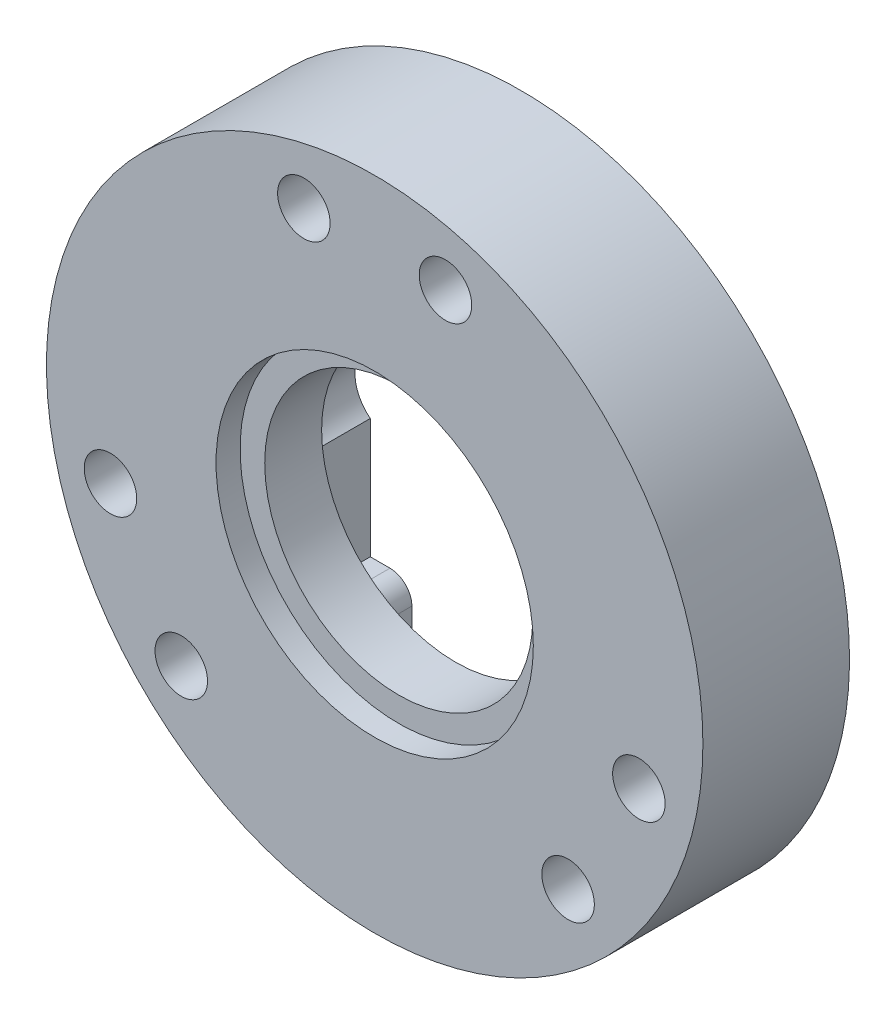
ISO-10303-21;
HEADER;
FILE_DESCRIPTION(('STEP AP214'),'2;1');
FILE_NAME('part.step','',(''),(''),'','','');
FILE_SCHEMA(('AUTOMOTIVE_DESIGN { 1 0 10303 214 1 1 1 1 }'));
ENDSEC;
DATA;
#1=APPLICATION_CONTEXT('core data for automotive mechanical design processes');
#2=APPLICATION_PROTOCOL_DEFINITION('international standard','automotive_design',2000,#1);
#3=PRODUCT_CONTEXT('',#1,'mechanical');
#4=PRODUCT('Part','Part','',(#3));
#5=PRODUCT_RELATED_PRODUCT_CATEGORY('part','',(#4));
#6=PRODUCT_DEFINITION_FORMATION('','',#4);
#7=PRODUCT_DEFINITION_CONTEXT('part definition',#1,'design');
#8=PRODUCT_DEFINITION('design','',#6,#7);
#9=PRODUCT_DEFINITION_SHAPE('','',#8);
#10=(LENGTH_UNIT() NAMED_UNIT(*) SI_UNIT(.MILLI.,.METRE.));
#11=(NAMED_UNIT(*) PLANE_ANGLE_UNIT() SI_UNIT($,.RADIAN.));
#12=(NAMED_UNIT(*) SI_UNIT($,.STERADIAN.) SOLID_ANGLE_UNIT());
#13=UNCERTAINTY_MEASURE_WITH_UNIT(LENGTH_MEASURE(1.E-05),#10,'distance_accuracy_value','');
#14=(GEOMETRIC_REPRESENTATION_CONTEXT(3) GLOBAL_UNCERTAINTY_ASSIGNED_CONTEXT((#13)) GLOBAL_UNIT_ASSIGNED_CONTEXT((#10,
#11,#12)) REPRESENTATION_CONTEXT('',''));
#15=CARTESIAN_POINT('',(0.,0.,0.));
#16=DIRECTION('',(0.,0.,1.));
#17=DIRECTION('',(1.,0.,0.));
#18=AXIS2_PLACEMENT_3D('',#15,#16,#17);
#19=CARTESIAN_POINT('',(0.,0.,5.6));
#20=DIRECTION('',(0.,0.,1.));
#21=DIRECTION('',(1.,0.,0.));
#22=AXIS2_PLACEMENT_3D('',#19,#20,#21);
#23=PLANE('',#22);
#24=CARTESIAN_POINT('',(0.,0.,5.6));
#25=DIRECTION('',(0.,0.,1.));
#26=DIRECTION('',(1.,0.,0.));
#27=AXIS2_PLACEMENT_3D('',#24,#25,#26);
#28=CIRCLE('',#27,6.125);
#29=CARTESIAN_POINT('',(6.125,0.,5.6));
#30=VERTEX_POINT('',#29);
#31=EDGE_CURVE('E337',#30,#30,#28,.T.);
#32=ORIENTED_EDGE('',*,*,#31,.F.);
#33=EDGE_LOOP('',(#32));
#34=FACE_BOUND('',#33,.T.);
#35=CARTESIAN_POINT('',(0.,0.,5.6));
#36=DIRECTION('',(0.,0.,1.));
#37=DIRECTION('',(1.,0.,0.));
#38=AXIS2_PLACEMENT_3D('',#35,#36,#37);
#39=CIRCLE('',#38,7.25);
#40=CARTESIAN_POINT('',(7.25,0.,5.6));
#41=VERTEX_POINT('',#40);
#42=EDGE_CURVE('E220',#41,#41,#39,.F.);
#43=ORIENTED_EDGE('',*,*,#42,.F.);
#44=EDGE_LOOP('',(#43));
#45=FACE_BOUND('',#44,.T.);
#46=ADVANCED_FACE('F35',(#34,#45),#23,.T.);
#47=CARTESIAN_POINT('',(6.90000000000001,-6.9,3.));
#48=DIRECTION('',(1.,0.,0.));
#49=DIRECTION('',(0.,1.,0.));
#50=AXIS2_PLACEMENT_3D('',#47,#48,#49);
#51=PLANE('',#50);
#52=DIRECTION('',(0.,-1.,0.));
#53=VECTOR('',#52,1.);
#54=CARTESIAN_POINT('',(6.90000000000001,-6.9,0.));
#55=LINE('',#54,#53);
#56=CARTESIAN_POINT('',(6.9,6.9,0.));
#57=VERTEX_POINT('',#56);
#58=CARTESIAN_POINT('',(6.9,1.4247806848775,0.));
#59=VERTEX_POINT('',#58);
#60=EDGE_CURVE('E143',#57,#59,#55,.T.);
#61=ORIENTED_EDGE('',*,*,#60,.T.);
#62=DIRECTION('',(0.,0.,1.));
#63=VECTOR('',#62,1.);
#64=CARTESIAN_POINT('',(6.9,1.4247806848775,0.));
#65=LINE('',#64,#63);
#66=CARTESIAN_POINT('',(6.9,1.4247806848775,3.));
#67=VERTEX_POINT('',#66);
#68=EDGE_CURVE('E135',#59,#67,#65,.T.);
#69=ORIENTED_EDGE('',*,*,#68,.T.);
#70=DIRECTION('',(0.,-1.,0.));
#71=VECTOR('',#70,1.);
#72=CARTESIAN_POINT('',(6.90000000000001,-6.9,3.));
#73=LINE('',#72,#71);
#74=CARTESIAN_POINT('',(6.9,6.9,3.));
#75=VERTEX_POINT('',#74);
#76=EDGE_CURVE('E140',#75,#67,#73,.T.);
#77=ORIENTED_EDGE('',*,*,#76,.F.);
#78=DIRECTION('',(0.,0.,-1.));
#79=VECTOR('',#78,1.);
#80=CARTESIAN_POINT('',(6.9,6.9,3.));
#81=LINE('',#80,#79);
#82=EDGE_CURVE('E181',#75,#57,#81,.T.);
#83=ORIENTED_EDGE('',*,*,#82,.T.);
#84=EDGE_LOOP('',(#61,#69,#77,#83));
#85=FACE_BOUND('',#84,.T.);
#86=ADVANCED_FACE('F137',(#85),#51,.F.);
#87=CARTESIAN_POINT('',(-6.9,-6.9,3.));
#88=DIRECTION('',(-1.,0.,0.));
#89=DIRECTION('',(0.,0.,1.));
#90=AXIS2_PLACEMENT_3D('',#87,#88,#89);
#91=PLANE('',#90);
#92=DIRECTION('',(0.,1.,0.));
#93=VECTOR('',#92,1.);
#94=CARTESIAN_POINT('',(-6.9,-6.9,0.));
#95=LINE('',#94,#93);
#96=CARTESIAN_POINT('',(-6.9,-6.9,0.));
#97=VERTEX_POINT('',#96);
#98=CARTESIAN_POINT('',(-6.9,-1.4247806848775,0.));
#99=VERTEX_POINT('',#98);
#100=EDGE_CURVE('E195',#97,#99,#95,.T.);
#101=ORIENTED_EDGE('',*,*,#100,.T.);
#102=DIRECTION('',(0.,0.,1.));
#103=VECTOR('',#102,1.);
#104=CARTESIAN_POINT('',(-6.9,-1.4247806848775,0.));
#105=LINE('',#104,#103);
#106=CARTESIAN_POINT('',(-6.9,-1.4247806848775,3.));
#107=VERTEX_POINT('',#106);
#108=EDGE_CURVE('E330',#99,#107,#105,.T.);
#109=ORIENTED_EDGE('',*,*,#108,.T.);
#110=DIRECTION('',(0.,1.,0.));
#111=VECTOR('',#110,1.);
#112=CARTESIAN_POINT('',(-6.9,-6.9,3.));
#113=LINE('',#112,#111);
#114=CARTESIAN_POINT('',(-6.9,-6.9,3.));
#115=VERTEX_POINT('',#114);
#116=EDGE_CURVE('E177',#115,#107,#113,.T.);
#117=ORIENTED_EDGE('',*,*,#116,.F.);
#118=DIRECTION('',(0.,0.,-1.));
#119=VECTOR('',#118,1.);
#120=CARTESIAN_POINT('',(-6.9,-6.9,3.));
#121=LINE('',#120,#119);
#122=EDGE_CURVE('E203',#115,#97,#121,.T.);
#123=ORIENTED_EDGE('',*,*,#122,.T.);
#124=EDGE_LOOP('',(#101,#109,#117,#123));
#125=FACE_BOUND('',#124,.T.);
#126=ADVANCED_FACE('F277',(#125),#91,.F.);
#127=CARTESIAN_POINT('',(6.90000000000001,-1.42478068487749,3.));
#128=VERTEX_POINT('',#127);
#129=CARTESIAN_POINT('',(6.90000000000001,-6.9,3.));
#130=VERTEX_POINT('',#129);
#131=EDGE_CURVE('E163',#128,#130,#73,.T.);
#132=ORIENTED_EDGE('',*,*,#131,.F.);
#133=DIRECTION('',(0.,0.,1.));
#134=VECTOR('',#133,1.);
#135=CARTESIAN_POINT('',(6.90000000000001,-1.42478068487749,0.));
#136=LINE('',#135,#134);
#137=CARTESIAN_POINT('',(6.90000000000001,-1.42478068487749,0.));
#138=VERTEX_POINT('',#137);
#139=EDGE_CURVE('E147',#128,#138,#136,.F.);
#140=ORIENTED_EDGE('',*,*,#139,.T.);
#141=CARTESIAN_POINT('',(6.90000000000001,-6.9,0.));
#142=VERTEX_POINT('',#141);
#143=EDGE_CURVE('E146',#138,#142,#55,.T.);
#144=ORIENTED_EDGE('',*,*,#143,.T.);
#145=DIRECTION('',(0.,0.,-1.));
#146=VECTOR('',#145,1.);
#147=CARTESIAN_POINT('',(6.90000000000001,-6.9,3.));
#148=LINE('',#147,#146);
#149=EDGE_CURVE('E212',#130,#142,#148,.T.);
#150=ORIENTED_EDGE('',*,*,#149,.F.);
#151=EDGE_LOOP('',(#132,#140,#144,#150));
#152=FACE_BOUND('',#151,.T.);
#153=ADVANCED_FACE('F279',(#152),#51,.F.);
#154=CARTESIAN_POINT('',(6.90000000000001,-6.9,3.));
#155=DIRECTION('',(0.,-1.,0.));
#156=DIRECTION('',(1.,0.,0.));
#157=AXIS2_PLACEMENT_3D('',#154,#155,#156);
#158=PLANE('',#157);
#159=DIRECTION('',(-1.,0.,0.));
#160=VECTOR('',#159,1.);
#161=CARTESIAN_POINT('',(6.90000000000001,-6.9,0.));
#162=LINE('',#161,#160);
#163=CARTESIAN_POINT('',(6.,-6.9,0.));
#164=VERTEX_POINT('',#163);
#165=EDGE_CURVE('E183',#142,#164,#162,.T.);
#166=ORIENTED_EDGE('',*,*,#165,.T.);
#167=DIRECTION('',(0.,0.,-1.));
#168=VECTOR('',#167,1.);
#169=CARTESIAN_POINT('',(6.,-6.9,3.));
#170=LINE('',#169,#168);
#171=CARTESIAN_POINT('',(6.,-6.9,3.));
#172=VERTEX_POINT('',#171);
#173=EDGE_CURVE('E50',#164,#172,#170,.F.);
#174=ORIENTED_EDGE('',*,*,#173,.T.);
#175=DIRECTION('',(-1.,0.,0.));
#176=VECTOR('',#175,1.);
#177=CARTESIAN_POINT('',(6.90000000000001,-6.9,3.));
#178=LINE('',#177,#176);
#179=EDGE_CURVE('E162',#130,#172,#178,.T.);
#180=ORIENTED_EDGE('',*,*,#179,.F.);
#181=ORIENTED_EDGE('',*,*,#149,.T.);
#182=EDGE_LOOP('',(#166,#174,#180,#181));
#183=FACE_BOUND('',#182,.T.);
#184=ADVANCED_FACE('F314',(#183),#158,.F.);
#185=CARTESIAN_POINT('',(5.,-6.9,3.));
#186=DIRECTION('',(1.,0.,0.));
#187=DIRECTION('',(0.,0.,-1.));
#188=AXIS2_PLACEMENT_3D('',#185,#186,#187);
#189=PLANE('',#188);
#190=DIRECTION('',(0.,-1.,0.));
#191=VECTOR('',#190,1.);
#192=CARTESIAN_POINT('',(5.,-6.9,3.));
#193=LINE('',#192,#191);
#194=CARTESIAN_POINT('',(5.,-7.9,3.));
#195=VERTEX_POINT('',#194);
#196=CARTESIAN_POINT('',(5.,-14.1421356237309,3.));
#197=VERTEX_POINT('',#196);
#198=EDGE_CURVE('E165',#195,#197,#193,.T.);
#199=ORIENTED_EDGE('',*,*,#198,.F.);
#200=DIRECTION('',(0.,0.,-1.));
#201=VECTOR('',#200,1.);
#202=CARTESIAN_POINT('',(5.,-7.9,3.));
#203=LINE('',#202,#201);
#204=CARTESIAN_POINT('',(5.,-7.9,0.));
#205=VERTEX_POINT('',#204);
#206=EDGE_CURVE('E232',#195,#205,#203,.T.);
#207=ORIENTED_EDGE('',*,*,#206,.T.);
#208=DIRECTION('',(0.,-1.,0.));
#209=VECTOR('',#208,1.);
#210=CARTESIAN_POINT('',(5.,-6.9,0.));
#211=LINE('',#210,#209);
#212=CARTESIAN_POINT('',(5.,-14.1421356237309,0.));
#213=VERTEX_POINT('',#212);
#214=EDGE_CURVE('E185',#205,#213,#211,.T.);
#215=ORIENTED_EDGE('',*,*,#214,.T.);
#216=DIRECTION('',(0.,0.,-1.));
#217=VECTOR('',#216,1.);
#218=CARTESIAN_POINT('',(5.,-14.1421356237309,3.));
#219=LINE('',#218,#217);
#220=EDGE_CURVE('E209',#197,#213,#219,.T.);
#221=ORIENTED_EDGE('',*,*,#220,.F.);
#222=EDGE_LOOP('',(#199,#207,#215,#221));
#223=FACE_BOUND('',#222,.T.);
#224=ADVANCED_FACE('F263',(#223),#189,.F.);
#225=CARTESIAN_POINT('',(0.,0.,3.));
#226=DIRECTION('',(0.,0.,-1.));
#227=DIRECTION('',(-1.,0.,0.));
#228=AXIS2_PLACEMENT_3D('',#225,#226,#227);
#229=CYLINDRICAL_SURFACE('',#228,15.);
#230=CARTESIAN_POINT('',(0.,0.,0.));
#231=DIRECTION('',(0.,0.,1.));
#232=DIRECTION('',(1.,0.,0.));
#233=AXIS2_PLACEMENT_3D('',#230,#231,#232);
#234=CIRCLE('',#233,15.);
#235=CARTESIAN_POINT('',(-5.00000000000001,-14.1421356237309,0.));
#236=VERTEX_POINT('',#235);
#237=EDGE_CURVE('E187',#213,#236,#234,.T.);
#238=ORIENTED_EDGE('',*,*,#237,.T.);
#239=DIRECTION('',(0.,0.,-1.));
#240=VECTOR('',#239,1.);
#241=CARTESIAN_POINT('',(-5.00000000000001,-14.1421356237309,3.));
#242=LINE('',#241,#240);
#243=CARTESIAN_POINT('',(-5.00000000000001,-14.1421356237309,3.));
#244=VERTEX_POINT('',#243);
#245=EDGE_CURVE('E206',#244,#236,#242,.T.);
#246=ORIENTED_EDGE('',*,*,#245,.F.);
#247=CARTESIAN_POINT('',(0.,0.,3.));
#248=DIRECTION('',(0.,0.,1.));
#249=DIRECTION('',(1.,0.,0.));
#250=AXIS2_PLACEMENT_3D('',#247,#248,#249);
#251=CIRCLE('',#250,15.);
#252=EDGE_CURVE('E156',#244,#197,#251,.T.);
#253=ORIENTED_EDGE('',*,*,#252,.T.);
#254=ORIENTED_EDGE('',*,*,#220,.T.);
#255=EDGE_LOOP('',(#238,#246,#253,#254));
#256=FACE_BOUND('',#255,.T.);
#257=CARTESIAN_POINT('',(0.,0.,6.7));
#258=DIRECTION('',(0.,0.,1.));
#259=DIRECTION('',(1.,0.,0.));
#260=AXIS2_PLACEMENT_3D('',#257,#258,#259);
#261=CIRCLE('',#260,15.);
#262=CARTESIAN_POINT('',(15.,0.,6.7));
#263=VERTEX_POINT('',#262);
#264=EDGE_CURVE('E341',#263,#263,#261,.T.);
#265=ORIENTED_EDGE('',*,*,#264,.F.);
#266=EDGE_LOOP('',(#265));
#267=FACE_BOUND('',#266,.T.);
#268=ADVANCED_FACE('F257',(#256,#267),#229,.T.);
#269=CARTESIAN_POINT('',(-5.,-6.9,3.));
#270=DIRECTION('',(-1.,0.,0.));
#271=DIRECTION('',(0.,-1.,0.));
#272=AXIS2_PLACEMENT_3D('',#269,#270,#271);
#273=PLANE('',#272);
#274=DIRECTION('',(0.,1.,0.));
#275=VECTOR('',#274,1.);
#276=CARTESIAN_POINT('',(-5.,-6.9,0.));
#277=LINE('',#276,#275);
#278=CARTESIAN_POINT('',(-5.,-7.9,0.));
#279=VERTEX_POINT('',#278);
#280=EDGE_CURVE('E189',#236,#279,#277,.T.);
#281=ORIENTED_EDGE('',*,*,#280,.T.);
#282=DIRECTION('',(0.,0.,-1.));
#283=VECTOR('',#282,1.);
#284=CARTESIAN_POINT('',(-5.,-7.9,3.));
#285=LINE('',#284,#283);
#286=CARTESIAN_POINT('',(-5.,-7.9,3.));
#287=VERTEX_POINT('',#286);
#288=EDGE_CURVE('E230',#279,#287,#285,.F.);
#289=ORIENTED_EDGE('',*,*,#288,.T.);
#290=DIRECTION('',(0.,1.,0.));
#291=VECTOR('',#290,1.);
#292=CARTESIAN_POINT('',(-5.,-6.9,3.));
#293=LINE('',#292,#291);
#294=EDGE_CURVE('E171',#244,#287,#293,.T.);
#295=ORIENTED_EDGE('',*,*,#294,.F.);
#296=ORIENTED_EDGE('',*,*,#245,.T.);
#297=EDGE_LOOP('',(#281,#289,#295,#296));
#298=FACE_BOUND('',#297,.T.);
#299=ADVANCED_FACE('F254',(#298),#273,.F.);
#300=CARTESIAN_POINT('',(-5.,-6.9,3.));
#301=DIRECTION('',(0.,-1.,0.));
#302=DIRECTION('',(0.,0.,-1.));
#303=AXIS2_PLACEMENT_3D('',#300,#301,#302);
#304=PLANE('',#303);
#305=DIRECTION('',(-1.,0.,0.));
#306=VECTOR('',#305,1.);
#307=CARTESIAN_POINT('',(-5.,-6.9,3.));
#308=LINE('',#307,#306);
#309=CARTESIAN_POINT('',(-6.,-6.9,3.));
#310=VERTEX_POINT('',#309);
#311=EDGE_CURVE('E174',#310,#115,#308,.T.);
#312=ORIENTED_EDGE('',*,*,#311,.F.);
#313=DIRECTION('',(0.,0.,-1.));
#314=VECTOR('',#313,1.);
#315=CARTESIAN_POINT('',(-6.,-6.9,3.));
#316=LINE('',#315,#314);
#317=CARTESIAN_POINT('',(-6.,-6.9,0.));
#318=VERTEX_POINT('',#317);
#319=EDGE_CURVE('E223',#310,#318,#316,.T.);
#320=ORIENTED_EDGE('',*,*,#319,.T.);
#321=DIRECTION('',(-1.,0.,0.));
#322=VECTOR('',#321,1.);
#323=CARTESIAN_POINT('',(-5.,-6.9,0.));
#324=LINE('',#323,#322);
#325=EDGE_CURVE('E192',#318,#97,#324,.T.);
#326=ORIENTED_EDGE('',*,*,#325,.T.);
#327=ORIENTED_EDGE('',*,*,#122,.F.);
#328=EDGE_LOOP('',(#312,#320,#326,#327));
#329=FACE_BOUND('',#328,.T.);
#330=ADVANCED_FACE('F244',(#329),#304,.F.);
#331=CARTESIAN_POINT('',(-6.9,1.4247806848775,3.));
#332=VERTEX_POINT('',#331);
#333=CARTESIAN_POINT('',(-6.9,6.9,3.));
#334=VERTEX_POINT('',#333);
#335=EDGE_CURVE('E176',#332,#334,#113,.T.);
#336=ORIENTED_EDGE('',*,*,#335,.F.);
#337=DIRECTION('',(0.,0.,1.));
#338=VECTOR('',#337,1.);
#339=CARTESIAN_POINT('',(-6.9,1.4247806848775,0.));
#340=LINE('',#339,#338);
#341=CARTESIAN_POINT('',(-6.9,1.4247806848775,0.));
#342=VERTEX_POINT('',#341);
#343=EDGE_CURVE('E329',#332,#342,#340,.F.);
#344=ORIENTED_EDGE('',*,*,#343,.T.);
#345=CARTESIAN_POINT('',(-6.9,6.9,0.));
#346=VERTEX_POINT('',#345);
#347=EDGE_CURVE('E194',#342,#346,#95,.T.);
#348=ORIENTED_EDGE('',*,*,#347,.T.);
#349=DIRECTION('',(0.,0.,-1.));
#350=VECTOR('',#349,1.);
#351=CARTESIAN_POINT('',(-6.9,6.9,3.));
#352=LINE('',#351,#350);
#353=EDGE_CURVE('E200',#334,#346,#352,.T.);
#354=ORIENTED_EDGE('',*,*,#353,.F.);
#355=EDGE_LOOP('',(#336,#344,#348,#354));
#356=FACE_BOUND('',#355,.T.);
#357=ADVANCED_FACE('F301',(#356),#91,.F.);
#358=CARTESIAN_POINT('',(6.9,6.9,3.));
#359=DIRECTION('',(0.,1.,0.));
#360=DIRECTION('',(-1.,0.,0.));
#361=AXIS2_PLACEMENT_3D('',#358,#359,#360);
#362=PLANE('',#361);
#363=DIRECTION('',(1.,0.,0.));
#364=VECTOR('',#363,1.);
#365=CARTESIAN_POINT('',(6.9,6.9,0.));
#366=LINE('',#365,#364);
#367=EDGE_CURVE('E167',#346,#57,#366,.T.);
#368=ORIENTED_EDGE('',*,*,#367,.T.);
#369=ORIENTED_EDGE('',*,*,#82,.F.);
#370=DIRECTION('',(1.,0.,0.));
#371=VECTOR('',#370,1.);
#372=CARTESIAN_POINT('',(6.9,6.9,3.));
#373=LINE('',#372,#371);
#374=EDGE_CURVE('E161',#334,#75,#373,.T.);
#375=ORIENTED_EDGE('',*,*,#374,.F.);
#376=ORIENTED_EDGE('',*,*,#353,.T.);
#377=EDGE_LOOP('',(#368,#369,#375,#376));
#378=FACE_BOUND('',#377,.T.);
#379=ADVANCED_FACE('F297',(#378),#362,.F.);
#380=CARTESIAN_POINT('',(0.,0.,0.));
#381=DIRECTION('',(0.,0.,1.));
#382=DIRECTION('',(1.,0.,0.));
#383=AXIS2_PLACEMENT_3D('',#380,#381,#382);
#384=PLANE('',#383);
#385=CARTESIAN_POINT('',(-12.0740728286129,-3.23523806378228,0.));
#386=DIRECTION('',(0.,0.,1.));
#387=DIRECTION('',(1.,0.,0.));
#388=AXIS2_PLACEMENT_3D('',#385,#386,#387);
#389=CIRCLE('',#388,1.2);
#390=CARTESIAN_POINT('',(-10.8740728286129,-3.23523806378228,0.));
#391=VERTEX_POINT('',#390);
#392=EDGE_CURVE('E371',#391,#391,#389,.T.);
#393=ORIENTED_EDGE('',*,*,#392,.T.);
#394=EDGE_LOOP('',(#393));
#395=FACE_BOUND('',#394,.T.);
#396=CARTESIAN_POINT('',(-8.83883476483135,-8.83883476483263,0.));
#397=DIRECTION('',(0.,0.,1.));
#398=DIRECTION('',(1.,0.,0.));
#399=AXIS2_PLACEMENT_3D('',#396,#397,#398);
#400=CIRCLE('',#399,1.20000000000097);
#401=CARTESIAN_POINT('',(-7.63883476483039,-8.83883476483263,0.));
#402=VERTEX_POINT('',#401);
#403=EDGE_CURVE('E377',#402,#402,#400,.T.);
#404=ORIENTED_EDGE('',*,*,#403,.T.);
#405=EDGE_LOOP('',(#404));
#406=FACE_BOUND('',#405,.T.);
#407=CARTESIAN_POINT('',(8.83883476483275,-8.83883476483182,0.));
#408=DIRECTION('',(0.,0.,1.));
#409=DIRECTION('',(1.,0.,0.));
#410=AXIS2_PLACEMENT_3D('',#407,#408,#409);
#411=CIRCLE('',#410,1.2);
#412=CARTESIAN_POINT('',(10.0388347648328,-8.83883476483182,0.));
#413=VERTEX_POINT('',#412);
#414=EDGE_CURVE('E360',#413,#413,#411,.T.);
#415=ORIENTED_EDGE('',*,*,#414,.T.);
#416=EDGE_LOOP('',(#415));
#417=FACE_BOUND('',#416,.T.);
#418=CARTESIAN_POINT('',(12.0740728286143,-3.23523806378146,0.));
#419=DIRECTION('',(0.,0.,1.));
#420=DIRECTION('',(1.,0.,0.));
#421=AXIS2_PLACEMENT_3D('',#418,#419,#420);
#422=CIRCLE('',#421,1.20000000000097);
#423=CARTESIAN_POINT('',(13.2740728286152,-3.23523806378146,0.));
#424=VERTEX_POINT('',#423);
#425=EDGE_CURVE('E359',#424,#424,#422,.T.);
#426=ORIENTED_EDGE('',*,*,#425,.T.);
#427=EDGE_LOOP('',(#426));
#428=FACE_BOUND('',#427,.T.);
#429=CARTESIAN_POINT('',(3.23523806378152,12.0740728286134,0.));
#430=DIRECTION('',(0.,0.,1.));
#431=DIRECTION('',(1.,0.,0.));
#432=AXIS2_PLACEMENT_3D('',#429,#430,#431);
#433=CIRCLE('',#432,1.2);
#434=CARTESIAN_POINT('',(4.43523806378152,12.0740728286134,0.));
#435=VERTEX_POINT('',#434);
#436=EDGE_CURVE('E353',#435,#435,#433,.T.);
#437=ORIENTED_EDGE('',*,*,#436,.T.);
#438=EDGE_LOOP('',(#437));
#439=FACE_BOUND('',#438,.T.);
#440=CARTESIAN_POINT('',(-3.23523806378152,12.0740728286134,0.));
#441=DIRECTION('',(0.,0.,1.));
#442=DIRECTION('',(1.,0.,0.));
#443=AXIS2_PLACEMENT_3D('',#440,#441,#442);
#444=CIRCLE('',#443,1.20000000000097);
#445=CARTESIAN_POINT('',(-2.03523806378055,12.0740728286134,0.));
#446=VERTEX_POINT('',#445);
#447=EDGE_CURVE('E349',#446,#446,#444,.T.);
#448=ORIENTED_EDGE('',*,*,#447,.T.);
#449=EDGE_LOOP('',(#448));
#450=FACE_BOUND('',#449,.T.);
#451=ORIENTED_EDGE('',*,*,#325,.F.);
#452=CARTESIAN_POINT('',(-6.,-7.9,0.));
#453=DIRECTION('',(0.,0.,1.));
#454=DIRECTION('',(1.,0.,0.));
#455=AXIS2_PLACEMENT_3D('',#452,#453,#454);
#456=CIRCLE('',#455,1.);
#457=EDGE_CURVE('E228',#318,#279,#456,.F.);
#458=ORIENTED_EDGE('',*,*,#457,.T.);
#459=ORIENTED_EDGE('',*,*,#280,.F.);
#460=ORIENTED_EDGE('',*,*,#237,.F.);
#461=ORIENTED_EDGE('',*,*,#214,.F.);
#462=CARTESIAN_POINT('',(6.,-7.9,0.));
#463=DIRECTION('',(0.,0.,1.));
#464=DIRECTION('',(1.,0.,0.));
#465=AXIS2_PLACEMENT_3D('',#462,#463,#464);
#466=CIRCLE('',#465,1.);
#467=EDGE_CURVE('E226',#205,#164,#466,.F.);
#468=ORIENTED_EDGE('',*,*,#467,.T.);
#469=ORIENTED_EDGE('',*,*,#165,.F.);
#470=ORIENTED_EDGE('',*,*,#143,.F.);
#471=CARTESIAN_POINT('',(5.8,0.,0.));
#472=DIRECTION('',(0.,0.,1.));
#473=DIRECTION('',(1.,0.,0.));
#474=AXIS2_PLACEMENT_3D('',#471,#472,#473);
#475=CIRCLE('',#474,1.8);
#476=EDGE_CURVE('E218',#138,#59,#475,.T.);
#477=ORIENTED_EDGE('',*,*,#476,.T.);
#478=ORIENTED_EDGE('',*,*,#60,.F.);
#479=ORIENTED_EDGE('',*,*,#367,.F.);
#480=ORIENTED_EDGE('',*,*,#347,.F.);
#481=CARTESIAN_POINT('',(-5.8,0.,0.));
#482=DIRECTION('',(0.,0.,1.));
#483=DIRECTION('',(1.,0.,0.));
#484=AXIS2_PLACEMENT_3D('',#481,#482,#483);
#485=CIRCLE('',#484,1.8);
#486=EDGE_CURVE('E215',#342,#99,#485,.T.);
#487=ORIENTED_EDGE('',*,*,#486,.T.);
#488=ORIENTED_EDGE('',*,*,#100,.F.);
#489=EDGE_LOOP('',(#451,#458,#459,#460,#461,#468,#469,#470,#477,#478,#479,#480,#487,#488));
#490=FACE_BOUND('',#489,.T.);
#491=ADVANCED_FACE('F250',(#395,#406,#417,#428,#439,#450,#490),#384,.F.);
#492=CARTESIAN_POINT('',(-5.8,0.,0.));
#493=DIRECTION('',(0.,0.,1.));
#494=DIRECTION('',(1.,0.,0.));
#495=AXIS2_PLACEMENT_3D('',#492,#493,#494);
#496=CYLINDRICAL_SURFACE('',#495,1.8);
#497=ORIENTED_EDGE('',*,*,#486,.F.);
#498=ORIENTED_EDGE('',*,*,#343,.F.);
#499=CARTESIAN_POINT('',(-5.8,0.,3.));
#500=DIRECTION('',(0.,0.,1.));
#501=DIRECTION('',(1.,0.,0.));
#502=AXIS2_PLACEMENT_3D('',#499,#500,#501);
#503=CIRCLE('',#502,1.8);
#504=EDGE_CURVE('E155',#332,#107,#503,.T.);
#505=ORIENTED_EDGE('',*,*,#504,.T.);
#506=ORIENTED_EDGE('',*,*,#108,.F.);
#507=EDGE_LOOP('',(#497,#498,#505,#506));
#508=FACE_BOUND('',#507,.T.);
#509=ADVANCED_FACE('F289',(#508),#496,.F.);
#510=CARTESIAN_POINT('',(5.8,0.,0.));
#511=DIRECTION('',(0.,0.,1.));
#512=DIRECTION('',(1.,0.,0.));
#513=AXIS2_PLACEMENT_3D('',#510,#511,#512);
#514=CYLINDRICAL_SURFACE('',#513,1.8);
#515=ORIENTED_EDGE('',*,*,#476,.F.);
#516=ORIENTED_EDGE('',*,*,#139,.F.);
#517=CARTESIAN_POINT('',(5.8,0.,3.));
#518=DIRECTION('',(0.,0.,1.));
#519=DIRECTION('',(1.,0.,0.));
#520=AXIS2_PLACEMENT_3D('',#517,#518,#519);
#521=CIRCLE('',#520,1.8);
#522=EDGE_CURVE('E150',#128,#67,#521,.T.);
#523=ORIENTED_EDGE('',*,*,#522,.T.);
#524=ORIENTED_EDGE('',*,*,#68,.F.);
#525=EDGE_LOOP('',(#515,#516,#523,#524));
#526=FACE_BOUND('',#525,.T.);
#527=ADVANCED_FACE('F151',(#526),#514,.F.);
#528=CARTESIAN_POINT('',(0.,0.,3.));
#529=DIRECTION('',(0.,0.,1.));
#530=DIRECTION('',(1.,0.,0.));
#531=AXIS2_PLACEMENT_3D('',#528,#529,#530);
#532=PLANE('',#531);
#533=CARTESIAN_POINT('',(0.,0.,3.));
#534=DIRECTION('',(0.,0.,1.));
#535=DIRECTION('',(1.,0.,0.));
#536=AXIS2_PLACEMENT_3D('',#533,#534,#535);
#537=CIRCLE('',#536,6.125);
#538=CARTESIAN_POINT('',(6.125,0.,3.));
#539=VERTEX_POINT('',#538);
#540=EDGE_CURVE('E338',#539,#539,#537,.T.);
#541=ORIENTED_EDGE('',*,*,#540,.T.);
#542=EDGE_LOOP('',(#541));
#543=FACE_BOUND('',#542,.T.);
#544=ORIENTED_EDGE('',*,*,#179,.T.);
#545=CARTESIAN_POINT('',(6.,-7.9,3.));
#546=DIRECTION('',(0.,0.,1.));
#547=DIRECTION('',(1.,0.,0.));
#548=AXIS2_PLACEMENT_3D('',#545,#546,#547);
#549=CIRCLE('',#548,1.);
#550=EDGE_CURVE('E11',#172,#195,#549,.T.);
#551=ORIENTED_EDGE('',*,*,#550,.T.);
#552=ORIENTED_EDGE('',*,*,#198,.T.);
#553=ORIENTED_EDGE('',*,*,#252,.F.);
#554=ORIENTED_EDGE('',*,*,#294,.T.);
#555=CARTESIAN_POINT('',(-6.,-7.9,3.));
#556=DIRECTION('',(0.,0.,1.));
#557=DIRECTION('',(1.,0.,0.));
#558=AXIS2_PLACEMENT_3D('',#555,#556,#557);
#559=CIRCLE('',#558,1.);
#560=EDGE_CURVE('E43',#287,#310,#559,.T.);
#561=ORIENTED_EDGE('',*,*,#560,.T.);
#562=ORIENTED_EDGE('',*,*,#311,.T.);
#563=ORIENTED_EDGE('',*,*,#116,.T.);
#564=ORIENTED_EDGE('',*,*,#504,.F.);
#565=ORIENTED_EDGE('',*,*,#335,.T.);
#566=ORIENTED_EDGE('',*,*,#374,.T.);
#567=ORIENTED_EDGE('',*,*,#76,.T.);
#568=ORIENTED_EDGE('',*,*,#522,.F.);
#569=ORIENTED_EDGE('',*,*,#131,.T.);
#570=EDGE_LOOP('',(#544,#551,#552,#553,#554,#561,#562,#563,#564,#565,#566,#567,#568,#569));
#571=FACE_BOUND('',#570,.T.);
#572=ADVANCED_FACE('F158',(#543,#571),#532,.F.);
#573=CARTESIAN_POINT('',(0.,0.,5.6));
#574=DIRECTION('',(0.,0.,-1.));
#575=DIRECTION('',(-1.,0.,0.));
#576=AXIS2_PLACEMENT_3D('',#573,#574,#575);
#577=CYLINDRICAL_SURFACE('',#576,6.125);
#578=ORIENTED_EDGE('',*,*,#31,.T.);
#579=EDGE_LOOP('',(#578));
#580=FACE_BOUND('',#579,.T.);
#581=ORIENTED_EDGE('',*,*,#540,.F.);
#582=EDGE_LOOP('',(#581));
#583=FACE_BOUND('',#582,.T.);
#584=ADVANCED_FACE('F284',(#580,#583),#577,.F.);
#585=CARTESIAN_POINT('',(0.,0.,6.7));
#586=DIRECTION('',(0.,0.,1.));
#587=DIRECTION('',(1.,0.,0.));
#588=AXIS2_PLACEMENT_3D('',#585,#586,#587);
#589=PLANE('',#588);
#590=CARTESIAN_POINT('',(-12.0740728286129,-3.23523806378228,6.7));
#591=DIRECTION('',(0.,0.,1.));
#592=DIRECTION('',(1.,0.,0.));
#593=AXIS2_PLACEMENT_3D('',#590,#591,#592);
#594=CIRCLE('',#593,1.2);
#595=CARTESIAN_POINT('',(-10.8740728286129,-3.23523806378228,6.7));
#596=VERTEX_POINT('',#595);
#597=EDGE_CURVE('E368',#596,#596,#594,.T.);
#598=ORIENTED_EDGE('',*,*,#597,.F.);
#599=EDGE_LOOP('',(#598));
#600=FACE_BOUND('',#599,.T.);
#601=CARTESIAN_POINT('',(-8.83883476483135,-8.83883476483263,6.7));
#602=DIRECTION('',(0.,0.,1.));
#603=DIRECTION('',(1.,0.,0.));
#604=AXIS2_PLACEMENT_3D('',#601,#602,#603);
#605=CIRCLE('',#604,1.20000000000097);
#606=CARTESIAN_POINT('',(-7.63883476483039,-8.83883476483263,6.7));
#607=VERTEX_POINT('',#606);
#608=EDGE_CURVE('E374',#607,#607,#605,.T.);
#609=ORIENTED_EDGE('',*,*,#608,.F.);
#610=EDGE_LOOP('',(#609));
#611=FACE_BOUND('',#610,.T.);
#612=CARTESIAN_POINT('',(8.83883476483275,-8.83883476483182,6.7));
#613=DIRECTION('',(0.,0.,1.));
#614=DIRECTION('',(1.,0.,0.));
#615=AXIS2_PLACEMENT_3D('',#612,#613,#614);
#616=CIRCLE('',#615,1.2);
#617=CARTESIAN_POINT('',(10.0388347648328,-8.83883476483182,6.7));
#618=VERTEX_POINT('',#617);
#619=EDGE_CURVE('E380',#618,#618,#616,.T.);
#620=ORIENTED_EDGE('',*,*,#619,.F.);
#621=EDGE_LOOP('',(#620));
#622=FACE_BOUND('',#621,.T.);
#623=CARTESIAN_POINT('',(12.0740728286143,-3.23523806378146,6.7));
#624=DIRECTION('',(0.,0.,1.));
#625=DIRECTION('',(1.,0.,0.));
#626=AXIS2_PLACEMENT_3D('',#623,#624,#625);
#627=CIRCLE('',#626,1.20000000000097);
#628=CARTESIAN_POINT('',(13.2740728286152,-3.23523806378146,6.7));
#629=VERTEX_POINT('',#628);
#630=EDGE_CURVE('E356',#629,#629,#627,.T.);
#631=ORIENTED_EDGE('',*,*,#630,.F.);
#632=EDGE_LOOP('',(#631));
#633=FACE_BOUND('',#632,.T.);
#634=CARTESIAN_POINT('',(3.23523806378152,12.0740728286134,6.7));
#635=DIRECTION('',(0.,0.,1.));
#636=DIRECTION('',(1.,0.,0.));
#637=AXIS2_PLACEMENT_3D('',#634,#635,#636);
#638=CIRCLE('',#637,1.2);
#639=CARTESIAN_POINT('',(4.43523806378152,12.0740728286134,6.7));
#640=VERTEX_POINT('',#639);
#641=EDGE_CURVE('E363',#640,#640,#638,.T.);
#642=ORIENTED_EDGE('',*,*,#641,.F.);
#643=EDGE_LOOP('',(#642));
#644=FACE_BOUND('',#643,.T.);
#645=CARTESIAN_POINT('',(-3.23523806378152,12.0740728286134,6.7));
#646=DIRECTION('',(0.,0.,1.));
#647=DIRECTION('',(1.,0.,0.));
#648=AXIS2_PLACEMENT_3D('',#645,#646,#647);
#649=CIRCLE('',#648,1.20000000000097);
#650=CARTESIAN_POINT('',(-2.03523806378055,12.0740728286134,6.7));
#651=VERTEX_POINT('',#650);
#652=EDGE_CURVE('E350',#651,#651,#649,.T.);
#653=ORIENTED_EDGE('',*,*,#652,.F.);
#654=EDGE_LOOP('',(#653));
#655=FACE_BOUND('',#654,.T.);
#656=ORIENTED_EDGE('',*,*,#264,.T.);
#657=EDGE_LOOP('',(#656));
#658=FACE_BOUND('',#657,.T.);
#659=CARTESIAN_POINT('',(0.,0.,6.7));
#660=DIRECTION('',(0.,0.,1.));
#661=DIRECTION('',(1.,0.,0.));
#662=AXIS2_PLACEMENT_3D('',#659,#660,#661);
#663=CIRCLE('',#662,7.25);
#664=CARTESIAN_POINT('',(7.25,0.,6.7));
#665=VERTEX_POINT('',#664);
#666=EDGE_CURVE('E346',#665,#665,#663,.T.);
#667=ORIENTED_EDGE('',*,*,#666,.F.);
#668=EDGE_LOOP('',(#667));
#669=FACE_BOUND('',#668,.T.);
#670=ADVANCED_FACE('F396',(#600,#611,#622,#633,#644,#655,#658,#669),#589,.T.);
#671=CARTESIAN_POINT('',(0.,0.,6.7));
#672=DIRECTION('',(0.,0.,-1.));
#673=DIRECTION('',(-1.,0.,0.));
#674=AXIS2_PLACEMENT_3D('',#671,#672,#673);
#675=CYLINDRICAL_SURFACE('',#674,7.25);
#676=ORIENTED_EDGE('',*,*,#666,.T.);
#677=EDGE_LOOP('',(#676));
#678=FACE_BOUND('',#677,.T.);
#679=ORIENTED_EDGE('',*,*,#42,.T.);
#680=EDGE_LOOP('',(#679));
#681=FACE_BOUND('',#680,.T.);
#682=ADVANCED_FACE('F399',(#678,#681),#675,.F.);
#683=CARTESIAN_POINT('',(-3.23523806378152,12.0740728286134,0.));
#684=DIRECTION('',(0.,0.,1.));
#685=DIRECTION('',(1.,0.,0.));
#686=AXIS2_PLACEMENT_3D('',#683,#684,#685);
#687=CYLINDRICAL_SURFACE('',#686,1.20000000000097);
#688=ORIENTED_EDGE('',*,*,#447,.F.);
#689=EDGE_LOOP('',(#688));
#690=FACE_BOUND('',#689,.T.);
#691=ORIENTED_EDGE('',*,*,#652,.T.);
#692=EDGE_LOOP('',(#691));
#693=FACE_BOUND('',#692,.T.);
#694=ADVANCED_FACE('F413',(#690,#693),#687,.F.);
#695=CARTESIAN_POINT('',(3.23523806378152,12.0740728286134,0.));
#696=DIRECTION('',(0.,0.,1.));
#697=DIRECTION('',(1.,0.,0.));
#698=AXIS2_PLACEMENT_3D('',#695,#696,#697);
#699=CYLINDRICAL_SURFACE('',#698,1.2);
#700=ORIENTED_EDGE('',*,*,#436,.F.);
#701=EDGE_LOOP('',(#700));
#702=FACE_BOUND('',#701,.T.);
#703=ORIENTED_EDGE('',*,*,#641,.T.);
#704=EDGE_LOOP('',(#703));
#705=FACE_BOUND('',#704,.T.);
#706=ADVANCED_FACE('F419',(#702,#705),#699,.F.);
#707=CARTESIAN_POINT('',(12.0740728286143,-3.23523806378146,0.));
#708=DIRECTION('',(0.,0.,1.));
#709=DIRECTION('',(1.,0.,0.));
#710=AXIS2_PLACEMENT_3D('',#707,#708,#709);
#711=CYLINDRICAL_SURFACE('',#710,1.20000000000097);
#712=ORIENTED_EDGE('',*,*,#425,.F.);
#713=EDGE_LOOP('',(#712));
#714=FACE_BOUND('',#713,.T.);
#715=ORIENTED_EDGE('',*,*,#630,.T.);
#716=EDGE_LOOP('',(#715));
#717=FACE_BOUND('',#716,.T.);
#718=ADVANCED_FACE('F392',(#714,#717),#711,.F.);
#719=CARTESIAN_POINT('',(8.83883476483275,-8.83883476483182,0.));
#720=DIRECTION('',(0.,0.,1.));
#721=DIRECTION('',(1.,0.,0.));
#722=AXIS2_PLACEMENT_3D('',#719,#720,#721);
#723=CYLINDRICAL_SURFACE('',#722,1.2);
#724=ORIENTED_EDGE('',*,*,#414,.F.);
#725=EDGE_LOOP('',(#724));
#726=FACE_BOUND('',#725,.T.);
#727=ORIENTED_EDGE('',*,*,#619,.T.);
#728=EDGE_LOOP('',(#727));
#729=FACE_BOUND('',#728,.T.);
#730=ADVANCED_FACE('F388',(#726,#729),#723,.F.);
#731=CARTESIAN_POINT('',(-8.83883476483135,-8.83883476483263,0.));
#732=DIRECTION('',(0.,0.,1.));
#733=DIRECTION('',(1.,0.,0.));
#734=AXIS2_PLACEMENT_3D('',#731,#732,#733);
#735=CYLINDRICAL_SURFACE('',#734,1.20000000000097);
#736=ORIENTED_EDGE('',*,*,#403,.F.);
#737=EDGE_LOOP('',(#736));
#738=FACE_BOUND('',#737,.T.);
#739=ORIENTED_EDGE('',*,*,#608,.T.);
#740=EDGE_LOOP('',(#739));
#741=FACE_BOUND('',#740,.T.);
#742=ADVANCED_FACE('F391',(#738,#741),#735,.F.);
#743=CARTESIAN_POINT('',(-12.0740728286129,-3.23523806378228,0.));
#744=DIRECTION('',(0.,0.,1.));
#745=DIRECTION('',(1.,0.,0.));
#746=AXIS2_PLACEMENT_3D('',#743,#744,#745);
#747=CYLINDRICAL_SURFACE('',#746,1.2);
#748=ORIENTED_EDGE('',*,*,#392,.F.);
#749=EDGE_LOOP('',(#748));
#750=FACE_BOUND('',#749,.T.);
#751=ORIENTED_EDGE('',*,*,#597,.T.);
#752=EDGE_LOOP('',(#751));
#753=FACE_BOUND('',#752,.T.);
#754=ADVANCED_FACE('F270',(#750,#753),#747,.F.);
#755=CARTESIAN_POINT('',(-6.,-7.9,3.));
#756=DIRECTION('',(0.,0.,-1.));
#757=DIRECTION('',(-1.,0.,0.));
#758=AXIS2_PLACEMENT_3D('',#755,#756,#757);
#759=CYLINDRICAL_SURFACE('',#758,1.);
#760=ORIENTED_EDGE('',*,*,#560,.F.);
#761=ORIENTED_EDGE('',*,*,#288,.F.);
#762=ORIENTED_EDGE('',*,*,#457,.F.);
#763=ORIENTED_EDGE('',*,*,#319,.F.);
#764=EDGE_LOOP('',(#760,#761,#762,#763));
#765=FACE_BOUND('',#764,.T.);
#766=ADVANCED_FACE('F247',(#765),#759,.T.);
#767=CARTESIAN_POINT('',(6.,-7.9,3.));
#768=DIRECTION('',(0.,0.,-1.));
#769=DIRECTION('',(-1.,0.,0.));
#770=AXIS2_PLACEMENT_3D('',#767,#768,#769);
#771=CYLINDRICAL_SURFACE('',#770,1.);
#772=ORIENTED_EDGE('',*,*,#550,.F.);
#773=ORIENTED_EDGE('',*,*,#173,.F.);
#774=ORIENTED_EDGE('',*,*,#467,.F.);
#775=ORIENTED_EDGE('',*,*,#206,.F.);
#776=EDGE_LOOP('',(#772,#773,#774,#775));
#777=FACE_BOUND('',#776,.T.);
#778=ADVANCED_FACE('F37',(#777),#771,.T.);
#779=CLOSED_SHELL('',(#46,#86,#126,#153,#184,#224,#268,#299,#330,#357,#379,#491,#509,#527,#572,
#584,#670,#682,#694,#706,#718,#730,#742,#754,#766,#778));
#780=MANIFOLD_SOLID_BREP('B2',#779);
#781=ADVANCED_BREP_SHAPE_REPRESENTATION('',(#18,#780),#14);
#782=SHAPE_DEFINITION_REPRESENTATION(#9,#781);
ENDSEC;
END-ISO-10303-21;
